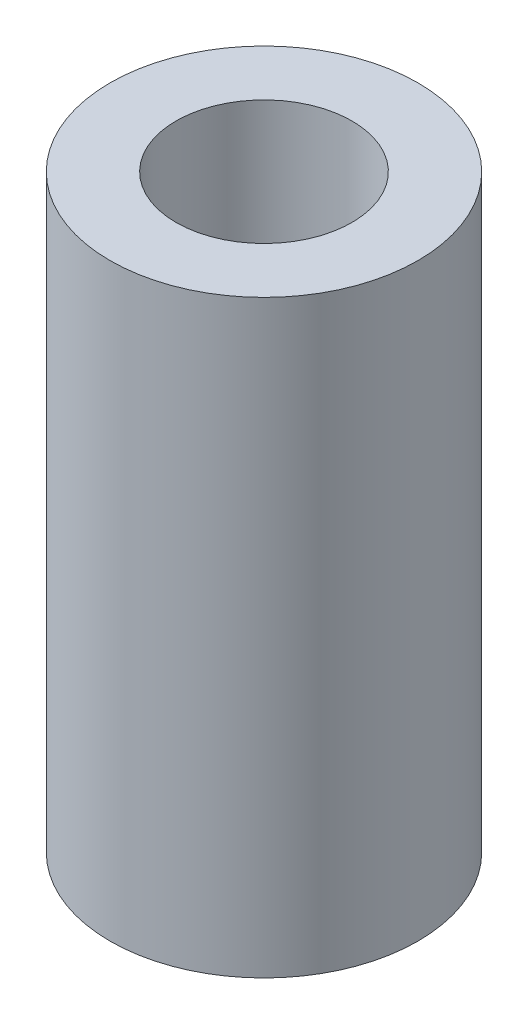
ISO-10303-21;
HEADER;
FILE_DESCRIPTION(('STEP AP214'),'2;1');
FILE_NAME('part.step','',(''),(''),'','','');
FILE_SCHEMA(('AUTOMOTIVE_DESIGN { 1 0 10303 214 1 1 1 1 }'));
ENDSEC;
DATA;
#1=APPLICATION_CONTEXT('core data for automotive mechanical design processes');
#2=APPLICATION_PROTOCOL_DEFINITION('international standard','automotive_design',2000,#1);
#3=PRODUCT_CONTEXT('',#1,'mechanical');
#4=PRODUCT('Part','Part','',(#3));
#5=PRODUCT_RELATED_PRODUCT_CATEGORY('part','',(#4));
#6=PRODUCT_DEFINITION_FORMATION('','',#4);
#7=PRODUCT_DEFINITION_CONTEXT('part definition',#1,'design');
#8=PRODUCT_DEFINITION('design','',#6,#7);
#9=PRODUCT_DEFINITION_SHAPE('','',#8);
#10=(LENGTH_UNIT() NAMED_UNIT(*) SI_UNIT(.MILLI.,.METRE.));
#11=(NAMED_UNIT(*) PLANE_ANGLE_UNIT() SI_UNIT($,.RADIAN.));
#12=(NAMED_UNIT(*) SI_UNIT($,.STERADIAN.) SOLID_ANGLE_UNIT());
#13=UNCERTAINTY_MEASURE_WITH_UNIT(LENGTH_MEASURE(1.E-05),#10,'distance_accuracy_value','');
#14=(GEOMETRIC_REPRESENTATION_CONTEXT(3) GLOBAL_UNCERTAINTY_ASSIGNED_CONTEXT((#13)) GLOBAL_UNIT_ASSIGNED_CONTEXT((#10,
#11,#12)) REPRESENTATION_CONTEXT('',''));
#15=CARTESIAN_POINT('',(0.,0.,0.));
#16=DIRECTION('',(0.,0.,1.));
#17=DIRECTION('',(1.,0.,0.));
#18=AXIS2_PLACEMENT_3D('',#15,#16,#17);
#19=CARTESIAN_POINT('',(0.,6.7,0.));
#20=DIRECTION('',(0.,1.,0.));
#21=DIRECTION('',(0.,0.,1.));
#22=AXIS2_PLACEMENT_3D('',#19,#20,#21);
#23=PLANE('',#22);
#24=CARTESIAN_POINT('',(0.,6.7,0.));
#25=DIRECTION('',(0.,1.,0.));
#26=DIRECTION('',(0.,0.,1.));
#27=AXIS2_PLACEMENT_3D('',#24,#25,#26);
#28=CIRCLE('',#27,1.75);
#29=CARTESIAN_POINT('',(0.,6.7,1.75));
#30=VERTEX_POINT('',#29);
#31=EDGE_CURVE('E10',#30,#30,#28,.T.);
#32=ORIENTED_EDGE('',*,*,#31,.T.);
#33=EDGE_LOOP('',(#32));
#34=FACE_BOUND('',#33,.T.);
#35=CARTESIAN_POINT('',(0.,6.7,0.));
#36=DIRECTION('',(0.,1.,0.));
#37=DIRECTION('',(0.,0.,1.));
#38=AXIS2_PLACEMENT_3D('',#35,#36,#37);
#39=CIRCLE('',#38,0.999999999999999);
#40=CARTESIAN_POINT('',(0.,6.7,0.999999999999999));
#41=VERTEX_POINT('',#40);
#42=EDGE_CURVE('E42',#41,#41,#39,.T.);
#43=ORIENTED_EDGE('',*,*,#42,.F.);
#44=EDGE_LOOP('',(#43));
#45=FACE_BOUND('',#44,.T.);
#46=ADVANCED_FACE('F31',(#34,#45),#23,.T.);
#47=CARTESIAN_POINT('',(0.,0.,0.));
#48=DIRECTION('',(0.,1.,0.));
#49=DIRECTION('',(0.,0.,1.));
#50=AXIS2_PLACEMENT_3D('',#47,#48,#49);
#51=PLANE('',#50);
#52=CARTESIAN_POINT('',(0.,0.,0.));
#53=DIRECTION('',(0.,1.,0.));
#54=DIRECTION('',(0.,0.,1.));
#55=AXIS2_PLACEMENT_3D('',#52,#53,#54);
#56=CIRCLE('',#55,1.75);
#57=CARTESIAN_POINT('',(0.,0.,1.75));
#58=VERTEX_POINT('',#57);
#59=EDGE_CURVE('E35',#58,#58,#56,.T.);
#60=ORIENTED_EDGE('',*,*,#59,.F.);
#61=EDGE_LOOP('',(#60));
#62=FACE_BOUND('',#61,.T.);
#63=CARTESIAN_POINT('',(0.,0.,0.));
#64=DIRECTION('',(0.,1.,0.));
#65=DIRECTION('',(0.,0.,1.));
#66=AXIS2_PLACEMENT_3D('',#63,#64,#65);
#67=CIRCLE('',#66,0.999999999999999);
#68=CARTESIAN_POINT('',(0.,0.,0.999999999999999));
#69=VERTEX_POINT('',#68);
#70=EDGE_CURVE('E44',#69,#69,#67,.T.);
#71=ORIENTED_EDGE('',*,*,#70,.T.);
#72=EDGE_LOOP('',(#71));
#73=FACE_BOUND('',#72,.T.);
#74=ADVANCED_FACE('F54',(#62,#73),#51,.F.);
#75=CARTESIAN_POINT('',(0.,6.7,0.));
#76=DIRECTION('',(0.,-1.,0.));
#77=DIRECTION('',(0.,0.,-1.));
#78=AXIS2_PLACEMENT_3D('',#75,#76,#77);
#79=CYLINDRICAL_SURFACE('',#78,1.75);
#80=ORIENTED_EDGE('',*,*,#31,.F.);
#81=EDGE_LOOP('',(#80));
#82=FACE_BOUND('',#81,.T.);
#83=ORIENTED_EDGE('',*,*,#59,.T.);
#84=EDGE_LOOP('',(#83));
#85=FACE_BOUND('',#84,.T.);
#86=ADVANCED_FACE('F33',(#82,#85),#79,.T.);
#87=CARTESIAN_POINT('',(0.,6.7,0.));
#88=DIRECTION('',(0.,-1.,0.));
#89=DIRECTION('',(0.,0.,-1.));
#90=AXIS2_PLACEMENT_3D('',#87,#88,#89);
#91=CYLINDRICAL_SURFACE('',#90,0.999999999999999);
#92=ORIENTED_EDGE('',*,*,#42,.T.);
#93=EDGE_LOOP('',(#92));
#94=FACE_BOUND('',#93,.T.);
#95=ORIENTED_EDGE('',*,*,#70,.F.);
#96=EDGE_LOOP('',(#95));
#97=FACE_BOUND('',#96,.T.);
#98=ADVANCED_FACE('F50',(#94,#97),#91,.F.);
#99=CLOSED_SHELL('',(#46,#74,#86,#98));
#100=MANIFOLD_SOLID_BREP('B2',#99);
#101=ADVANCED_BREP_SHAPE_REPRESENTATION('',(#18,#100),#14);
#102=SHAPE_DEFINITION_REPRESENTATION(#9,#101);
ENDSEC;
END-ISO-10303-21;
